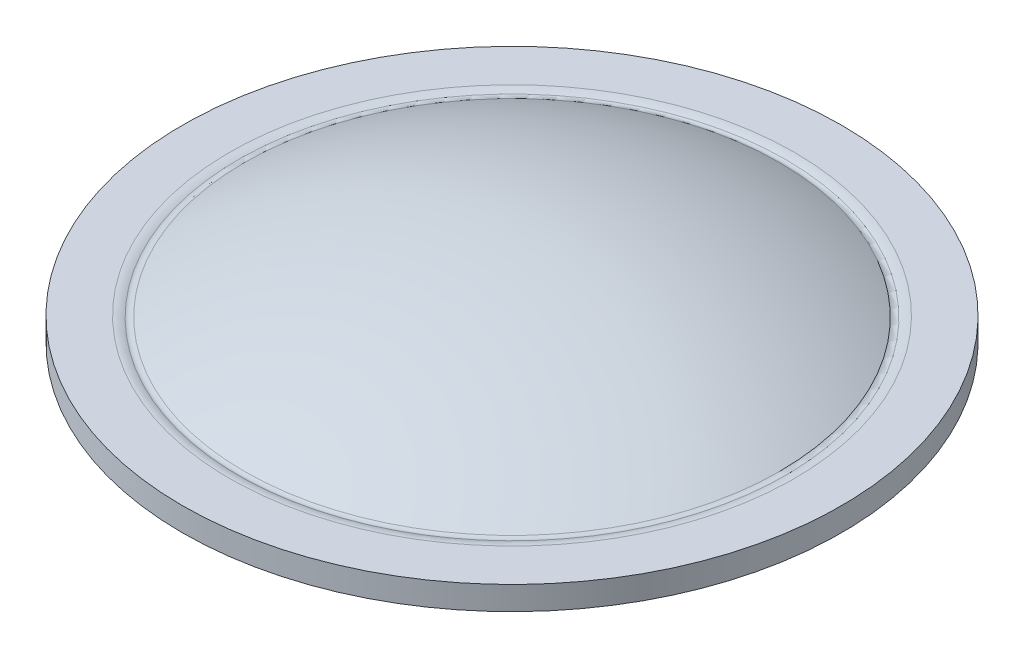
ISO-10303-21;
HEADER;
FILE_DESCRIPTION(('STEP AP214'),'2;1');
FILE_NAME('part.step','',(''),(''),'','','');
FILE_SCHEMA(('AUTOMOTIVE_DESIGN { 1 0 10303 214 1 1 1 1 }'));
ENDSEC;
DATA;
#1=APPLICATION_CONTEXT('core data for automotive mechanical design processes');
#2=APPLICATION_PROTOCOL_DEFINITION('international standard','automotive_design',2000,#1);
#3=PRODUCT_CONTEXT('',#1,'mechanical');
#4=PRODUCT('Part','Part','',(#3));
#5=PRODUCT_RELATED_PRODUCT_CATEGORY('part','',(#4));
#6=PRODUCT_DEFINITION_FORMATION('','',#4);
#7=PRODUCT_DEFINITION_CONTEXT('part definition',#1,'design');
#8=PRODUCT_DEFINITION('design','',#6,#7);
#9=PRODUCT_DEFINITION_SHAPE('','',#8);
#10=(LENGTH_UNIT() NAMED_UNIT(*) SI_UNIT(.MILLI.,.METRE.));
#11=(NAMED_UNIT(*) PLANE_ANGLE_UNIT() SI_UNIT($,.RADIAN.));
#12=(NAMED_UNIT(*) SI_UNIT($,.STERADIAN.) SOLID_ANGLE_UNIT());
#13=UNCERTAINTY_MEASURE_WITH_UNIT(LENGTH_MEASURE(1.E-05),#10,'distance_accuracy_value','');
#14=(GEOMETRIC_REPRESENTATION_CONTEXT(3) GLOBAL_UNCERTAINTY_ASSIGNED_CONTEXT((#13)) GLOBAL_UNIT_ASSIGNED_CONTEXT((#10,
#11,#12)) REPRESENTATION_CONTEXT('',''));
#15=CARTESIAN_POINT('',(0.,0.,0.));
#16=DIRECTION('',(0.,0.,1.));
#17=DIRECTION('',(1.,0.,0.));
#18=AXIS2_PLACEMENT_3D('',#15,#16,#17);
#19=CARTESIAN_POINT('',(-14.,-3.86602540378444,0.));
#20=DIRECTION('',(0.,1.,0.));
#21=DIRECTION('',(0.,0.,1.));
#22=AXIS2_PLACEMENT_3D('',#19,#20,#21);
#23=PLANE('',#22);
#24=CARTESIAN_POINT('',(0.,-3.86602540378444,0.));
#25=DIRECTION('',(0.,-1.,0.));
#26=DIRECTION('',(0.,0.,-1.));
#27=AXIS2_PLACEMENT_3D('',#24,#25,#26);
#28=CIRCLE('',#27,14.);
#29=CARTESIAN_POINT('',(0.,-3.86602540378444,-14.));
#30=VERTEX_POINT('',#29);
#31=EDGE_CURVE('E54',#30,#30,#28,.T.);
#32=ORIENTED_EDGE('',*,*,#31,.T.);
#33=EDGE_LOOP('',(#32));
#34=FACE_BOUND('',#33,.T.);
#35=CARTESIAN_POINT('',(0.,-3.86602540378444,0.));
#36=DIRECTION('',(0.,-1.,0.));
#37=DIRECTION('',(0.,0.,-1.));
#38=AXIS2_PLACEMENT_3D('',#35,#36,#37);
#39=CIRCLE('',#38,10.9998125895616);
#40=CARTESIAN_POINT('',(0.,-3.86602540378444,-10.9998125895616));
#41=VERTEX_POINT('',#40);
#42=EDGE_CURVE('E57',#41,#41,#39,.T.);
#43=ORIENTED_EDGE('',*,*,#42,.F.);
#44=EDGE_LOOP('',(#43));
#45=FACE_BOUND('',#44,.T.);
#46=ADVANCED_FACE('F34',(#34,#45),#23,.F.);
#47=CARTESIAN_POINT('',(0.,-23.5416666666667,0.));
#48=DIRECTION('',(0.,-1.,0.));
#49=DIRECTION('',(-1.,0.,0.));
#50=AXIS2_PLACEMENT_3D('',#47,#48,#49);
#51=SPHERICAL_SURFACE('',#50,23.5416666666667);
#52=CARTESIAN_POINT('',(0.,-2.92483237767939,0.));
#53=DIRECTION('',(0.,-1.,0.));
#54=DIRECTION('',(0.,0.,-1.));
#55=AXIS2_PLACEMENT_3D('',#52,#53,#54);
#56=CIRCLE('',#55,11.3646915200054);
#57=CARTESIAN_POINT('',(0.,-2.92483237767939,-11.3646915200054));
#58=VERTEX_POINT('',#57);
#59=EDGE_CURVE('E10',#58,#58,#56,.F.);
#60=ORIENTED_EDGE('',*,*,#59,.T.);
#61=EDGE_LOOP('',(#60));
#62=FACE_BOUND('',#61,.T.);
#63=ADVANCED_FACE('F64',(#62),#51,.T.);
#64=CARTESIAN_POINT('',(0.,-3.86602540378444,0.));
#65=DIRECTION('',(0.,-1.,0.));
#66=DIRECTION('',(0.,0.,-1.));
#67=AXIS2_PLACEMENT_3D('',#64,#65,#66);
#68=TOROIDAL_SURFACE('',#67,12.,1.);
#69=CARTESIAN_POINT('',(0.,-2.93993246078896,0.));
#70=DIRECTION('',(0.,-1.,0.));
#71=DIRECTION('',(0.,0.,-1.));
#72=AXIS2_PLACEMENT_3D('',#69,#70,#71);
#73=CIRCLE('',#72,11.6227045442438);
#74=CARTESIAN_POINT('',(0.,-2.93993246078896,-11.6227045442438));
#75=VERTEX_POINT('',#74);
#76=EDGE_CURVE('E41',#75,#75,#73,.T.);
#77=ORIENTED_EDGE('',*,*,#76,.T.);
#78=EDGE_LOOP('',(#77));
#79=FACE_BOUND('',#78,.T.);
#80=CARTESIAN_POINT('',(0.,-2.86602540378444,0.));
#81=DIRECTION('',(0.,-1.,0.));
#82=DIRECTION('',(0.,0.,-1.));
#83=AXIS2_PLACEMENT_3D('',#80,#81,#82);
#84=CIRCLE('',#83,12.);
#85=CARTESIAN_POINT('',(0.,-2.86602540378444,-12.));
#86=VERTEX_POINT('',#85);
#87=EDGE_CURVE('E45',#86,#86,#84,.T.);
#88=ORIENTED_EDGE('',*,*,#87,.F.);
#89=EDGE_LOOP('',(#88));
#90=FACE_BOUND('',#89,.T.);
#91=ADVANCED_FACE('F70',(#79,#90),#68,.T.);
#92=CARTESIAN_POINT('',(-12.,-2.86602540378444,0.));
#93=DIRECTION('',(0.,-1.,0.));
#94=DIRECTION('',(0.,0.,-1.));
#95=AXIS2_PLACEMENT_3D('',#92,#93,#94);
#96=PLANE('',#95);
#97=CARTESIAN_POINT('',(0.,-2.86602540378444,0.));
#98=DIRECTION('',(0.,-1.,0.));
#99=DIRECTION('',(0.,0.,-1.));
#100=AXIS2_PLACEMENT_3D('',#97,#98,#99);
#101=CIRCLE('',#100,14.);
#102=CARTESIAN_POINT('',(0.,-2.86602540378444,-14.));
#103=VERTEX_POINT('',#102);
#104=EDGE_CURVE('E49',#103,#103,#101,.T.);
#105=ORIENTED_EDGE('',*,*,#104,.F.);
#106=EDGE_LOOP('',(#105));
#107=FACE_BOUND('',#106,.T.);
#108=ORIENTED_EDGE('',*,*,#87,.T.);
#109=EDGE_LOOP('',(#108));
#110=FACE_BOUND('',#109,.T.);
#111=ADVANCED_FACE('F76',(#107,#110),#96,.F.);
#112=CARTESIAN_POINT('',(0.,-3.86602540378444,0.));
#113=DIRECTION('',(0.,-1.,0.));
#114=DIRECTION('',(0.,0.,-1.));
#115=AXIS2_PLACEMENT_3D('',#112,#113,#114);
#116=CYLINDRICAL_SURFACE('',#115,14.);
#117=ORIENTED_EDGE('',*,*,#31,.F.);
#118=EDGE_LOOP('',(#117));
#119=FACE_BOUND('',#118,.T.);
#120=ORIENTED_EDGE('',*,*,#104,.T.);
#121=EDGE_LOOP('',(#120));
#122=FACE_BOUND('',#121,.T.);
#123=ADVANCED_FACE('F73',(#119,#122),#116,.T.);
#124=CARTESIAN_POINT('',(0.,-23.5416666666667,0.));
#125=DIRECTION('',(0.,-1.,0.));
#126=DIRECTION('',(-1.,0.,0.));
#127=AXIS2_PLACEMENT_3D('',#124,#125,#126);
#128=SPHERICAL_SURFACE('',#127,22.5416666666667);
#129=ORIENTED_EDGE('',*,*,#42,.T.);
#130=EDGE_LOOP('',(#129));
#131=FACE_BOUND('',#130,.T.);
#132=ADVANCED_FACE('F61',(#131),#128,.F.);
#133=CARTESIAN_POINT('',(0.,-2.66210457789052,0.));
#134=DIRECTION('',(0.,1.,0.));
#135=DIRECTION('',(0.,0.,1.));
#136=AXIS2_PLACEMENT_3D('',#133,#134,#135);
#137=TOROIDAL_SURFACE('',#136,11.509515907517,0.3);
#138=ORIENTED_EDGE('',*,*,#59,.F.);
#139=EDGE_LOOP('',(#138));
#140=FACE_BOUND('',#139,.T.);
#141=ORIENTED_EDGE('',*,*,#76,.F.);
#142=EDGE_LOOP('',(#141));
#143=FACE_BOUND('',#142,.T.);
#144=ADVANCED_FACE('F36',(#140,#143),#137,.F.);
#145=CLOSED_SHELL('',(#46,#63,#91,#111,#123,#132,#144));
#146=MANIFOLD_SOLID_BREP('B2',#145);
#147=ADVANCED_BREP_SHAPE_REPRESENTATION('',(#18,#146),#14);
#148=SHAPE_DEFINITION_REPRESENTATION(#9,#147);
ENDSEC;
END-ISO-10303-21;
